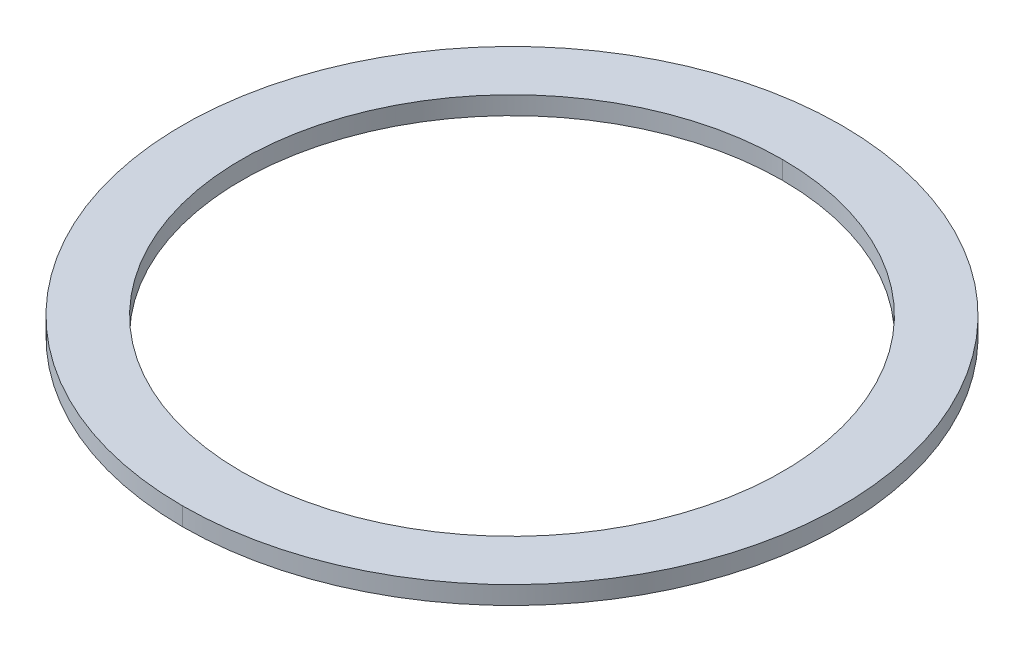
ISO-10303-21;
HEADER;
FILE_DESCRIPTION(('STEP AP214'),'2;1');
FILE_NAME('part.step','',(''),(''),'','','');
FILE_SCHEMA(('AUTOMOTIVE_DESIGN { 1 0 10303 214 1 1 1 1 }'));
ENDSEC;
DATA;
#1=APPLICATION_CONTEXT('core data for automotive mechanical design processes');
#2=APPLICATION_PROTOCOL_DEFINITION('international standard','automotive_design',2000,#1);
#3=PRODUCT_CONTEXT('',#1,'mechanical');
#4=PRODUCT('Part','Part','',(#3));
#5=PRODUCT_RELATED_PRODUCT_CATEGORY('part','',(#4));
#6=PRODUCT_DEFINITION_FORMATION('','',#4);
#7=PRODUCT_DEFINITION_CONTEXT('part definition',#1,'design');
#8=PRODUCT_DEFINITION('design','',#6,#7);
#9=PRODUCT_DEFINITION_SHAPE('','',#8);
#10=(LENGTH_UNIT() NAMED_UNIT(*) SI_UNIT(.MILLI.,.METRE.));
#11=(NAMED_UNIT(*) PLANE_ANGLE_UNIT() SI_UNIT($,.RADIAN.));
#12=(NAMED_UNIT(*) SI_UNIT($,.STERADIAN.) SOLID_ANGLE_UNIT());
#13=UNCERTAINTY_MEASURE_WITH_UNIT(LENGTH_MEASURE(1.E-05),#10,'distance_accuracy_value','');
#14=(GEOMETRIC_REPRESENTATION_CONTEXT(3) GLOBAL_UNCERTAINTY_ASSIGNED_CONTEXT((#13)) GLOBAL_UNIT_ASSIGNED_CONTEXT((#10,
#11,#12)) REPRESENTATION_CONTEXT('',''));
#15=CARTESIAN_POINT('',(0.,0.,0.));
#16=DIRECTION('',(0.,0.,1.));
#17=DIRECTION('',(1.,0.,0.));
#18=AXIS2_PLACEMENT_3D('',#15,#16,#17);
#19=CARTESIAN_POINT('',(0.,6.81685424949238,0.));
#20=DIRECTION('',(0.,-1.,0.));
#21=DIRECTION('',(0.,0.,-1.));
#22=AXIS2_PLACEMENT_3D('',#19,#20,#21);
#23=CYLINDRICAL_SURFACE('',#22,2.);
#24=CARTESIAN_POINT('',(0.,1.11,0.));
#25=DIRECTION('',(0.,1.,0.));
#26=DIRECTION('',(0.,0.,-1.));
#27=AXIS2_PLACEMENT_3D('',#24,#25,#26);
#28=CIRCLE('',#27,2.);
#29=CARTESIAN_POINT('',(0.,1.11,2.));
#30=VERTEX_POINT('',#29);
#31=CARTESIAN_POINT('',(0.,1.11,-2.));
#32=VERTEX_POINT('',#31);
#33=EDGE_CURVE('E11',#30,#32,#28,.T.);
#34=ORIENTED_EDGE('',*,*,#33,.F.);
#35=DIRECTION('',(0.,-1.,0.));
#36=VECTOR('',#35,1.);
#37=CARTESIAN_POINT('',(0.,6.81685424949238,2.));
#38=LINE('',#37,#36);
#39=CARTESIAN_POINT('',(0.,1.,2.));
#40=VERTEX_POINT('',#39);
#41=EDGE_CURVE('E23',#30,#40,#38,.T.);
#42=ORIENTED_EDGE('',*,*,#41,.T.);
#43=CARTESIAN_POINT('',(0.,1.,0.));
#44=DIRECTION('',(0.,1.,0.));
#45=DIRECTION('',(0.,0.,-1.));
#46=AXIS2_PLACEMENT_3D('',#43,#44,#45);
#47=CIRCLE('',#46,2.);
#48=CARTESIAN_POINT('',(0.,1.,-2.));
#49=VERTEX_POINT('',#48);
#50=EDGE_CURVE('E85',#40,#49,#47,.T.);
#51=ORIENTED_EDGE('',*,*,#50,.T.);
#52=DIRECTION('',(0.,-1.,0.));
#53=VECTOR('',#52,1.);
#54=CARTESIAN_POINT('',(0.,6.81685424949238,-2.));
#55=LINE('',#54,#53);
#56=EDGE_CURVE('E82',#32,#49,#55,.T.);
#57=ORIENTED_EDGE('',*,*,#56,.F.);
#58=EDGE_LOOP('',(#34,#42,#51,#57));
#59=FACE_BOUND('',#58,.T.);
#60=ADVANCED_FACE('F16',(#59),#23,.T.);
#61=CARTESIAN_POINT('',(0.,6.81685424949238,0.));
#62=DIRECTION('',(0.,-1.,0.));
#63=DIRECTION('',(0.,0.,-1.));
#64=AXIS2_PLACEMENT_3D('',#61,#62,#63);
#65=CYLINDRICAL_SURFACE('',#64,1.64116096886617);
#66=CARTESIAN_POINT('',(0.,1.11,0.));
#67=DIRECTION('',(0.,-1.,0.));
#68=DIRECTION('',(0.,0.,-1.));
#69=AXIS2_PLACEMENT_3D('',#66,#67,#68);
#70=CIRCLE('',#69,1.64116096886617);
#71=CARTESIAN_POINT('',(0.,1.11,1.64116096886617));
#72=VERTEX_POINT('',#71);
#73=CARTESIAN_POINT('',(0.,1.11,-1.64116096886617));
#74=VERTEX_POINT('',#73);
#75=EDGE_CURVE('E80',#72,#74,#70,.T.);
#76=ORIENTED_EDGE('',*,*,#75,.F.);
#77=DIRECTION('',(0.,-1.,0.));
#78=VECTOR('',#77,1.);
#79=CARTESIAN_POINT('',(0.,6.81685424949238,1.64116096886617));
#80=LINE('',#79,#78);
#81=CARTESIAN_POINT('',(0.,1.,1.64116096886617));
#82=VERTEX_POINT('',#81);
#83=EDGE_CURVE('E67',#72,#82,#80,.T.);
#84=ORIENTED_EDGE('',*,*,#83,.T.);
#85=CARTESIAN_POINT('',(0.,1.,0.));
#86=DIRECTION('',(0.,1.,0.));
#87=DIRECTION('',(0.,0.,-1.));
#88=AXIS2_PLACEMENT_3D('',#85,#86,#87);
#89=CIRCLE('',#88,1.64116096886617);
#90=CARTESIAN_POINT('',(0.,1.,-1.64116096886617));
#91=VERTEX_POINT('',#90);
#92=EDGE_CURVE('E62',#91,#82,#89,.T.);
#93=ORIENTED_EDGE('',*,*,#92,.F.);
#94=DIRECTION('',(0.,-1.,0.));
#95=VECTOR('',#94,1.);
#96=CARTESIAN_POINT('',(0.,6.81685424949238,-1.64116096886617));
#97=LINE('',#96,#95);
#98=EDGE_CURVE('E52',#74,#91,#97,.T.);
#99=ORIENTED_EDGE('',*,*,#98,.F.);
#100=EDGE_LOOP('',(#76,#84,#93,#99));
#101=FACE_BOUND('',#100,.T.);
#102=ADVANCED_FACE('F66',(#101),#65,.F.);
#103=CARTESIAN_POINT('',(-1.22928807039044,1.11,1.04302918199923));
#104=DIRECTION('',(0.,1.,0.));
#105=DIRECTION('',(0.,0.,1.));
#106=AXIS2_PLACEMENT_3D('',#103,#104,#105);
#107=PLANE('',#106);
#108=CARTESIAN_POINT('',(0.,1.11,0.));
#109=DIRECTION('',(0.,1.,0.));
#110=DIRECTION('',(0.,0.,-1.));
#111=AXIS2_PLACEMENT_3D('',#108,#109,#110);
#112=CIRCLE('',#111,2.);
#113=EDGE_CURVE('E63',#32,#30,#112,.T.);
#114=ORIENTED_EDGE('',*,*,#113,.T.);
#115=ORIENTED_EDGE('',*,*,#33,.T.);
#116=EDGE_LOOP('',(#114,#115));
#117=FACE_BOUND('',#116,.T.);
#118=CARTESIAN_POINT('',(0.,1.11,0.));
#119=DIRECTION('',(0.,-1.,0.));
#120=DIRECTION('',(0.,0.,-1.));
#121=AXIS2_PLACEMENT_3D('',#118,#119,#120);
#122=CIRCLE('',#121,1.64116096886617);
#123=EDGE_CURVE('E58',#74,#72,#122,.T.);
#124=ORIENTED_EDGE('',*,*,#123,.T.);
#125=ORIENTED_EDGE('',*,*,#75,.T.);
#126=EDGE_LOOP('',(#124,#125));
#127=FACE_BOUND('',#126,.T.);
#128=ADVANCED_FACE('F91',(#117,#127),#107,.T.);
#129=CARTESIAN_POINT('',(0.,6.81685424949238,0.));
#130=DIRECTION('',(0.,-1.,0.));
#131=DIRECTION('',(0.,0.,-1.));
#132=AXIS2_PLACEMENT_3D('',#129,#130,#131);
#133=CYLINDRICAL_SURFACE('',#132,2.);
#134=ORIENTED_EDGE('',*,*,#41,.F.);
#135=ORIENTED_EDGE('',*,*,#113,.F.);
#136=ORIENTED_EDGE('',*,*,#56,.T.);
#137=CARTESIAN_POINT('',(0.,1.,0.));
#138=DIRECTION('',(0.,1.,0.));
#139=DIRECTION('',(0.,0.,-1.));
#140=AXIS2_PLACEMENT_3D('',#137,#138,#139);
#141=CIRCLE('',#140,2.);
#142=EDGE_CURVE('E72',#49,#40,#141,.T.);
#143=ORIENTED_EDGE('',*,*,#142,.T.);
#144=EDGE_LOOP('',(#134,#135,#136,#143));
#145=FACE_BOUND('',#144,.T.);
#146=ADVANCED_FACE('F90',(#145),#133,.T.);
#147=CARTESIAN_POINT('',(0.,6.81685424949238,0.));
#148=DIRECTION('',(0.,-1.,0.));
#149=DIRECTION('',(0.,0.,-1.));
#150=AXIS2_PLACEMENT_3D('',#147,#148,#149);
#151=CYLINDRICAL_SURFACE('',#150,1.64116096886617);
#152=ORIENTED_EDGE('',*,*,#83,.F.);
#153=ORIENTED_EDGE('',*,*,#123,.F.);
#154=ORIENTED_EDGE('',*,*,#98,.T.);
#155=CARTESIAN_POINT('',(0.,1.,0.));
#156=DIRECTION('',(0.,1.,0.));
#157=DIRECTION('',(0.,0.,-1.));
#158=AXIS2_PLACEMENT_3D('',#155,#156,#157);
#159=CIRCLE('',#158,1.64116096886617);
#160=EDGE_CURVE('E56',#82,#91,#159,.T.);
#161=ORIENTED_EDGE('',*,*,#160,.F.);
#162=EDGE_LOOP('',(#152,#153,#154,#161));
#163=FACE_BOUND('',#162,.T.);
#164=ADVANCED_FACE('F54',(#163),#151,.F.);
#165=CARTESIAN_POINT('',(0.,1.,0.));
#166=DIRECTION('',(0.,1.,0.));
#167=DIRECTION('',(0.,0.,1.));
#168=AXIS2_PLACEMENT_3D('',#165,#166,#167);
#169=PLANE('',#168);
#170=ORIENTED_EDGE('',*,*,#92,.T.);
#171=ORIENTED_EDGE('',*,*,#160,.T.);
#172=EDGE_LOOP('',(#170,#171));
#173=FACE_BOUND('',#172,.T.);
#174=ORIENTED_EDGE('',*,*,#142,.F.);
#175=ORIENTED_EDGE('',*,*,#50,.F.);
#176=EDGE_LOOP('',(#174,#175));
#177=FACE_BOUND('',#176,.T.);
#178=ADVANCED_FACE('F70',(#173,#177),#169,.F.);
#179=CLOSED_SHELL('',(#60,#102,#128,#146,#164,#178));
#180=MANIFOLD_SOLID_BREP('B1',#179);
#181=ADVANCED_BREP_SHAPE_REPRESENTATION('',(#18,#180),#14);
#182=SHAPE_DEFINITION_REPRESENTATION(#9,#181);
ENDSEC;
END-ISO-10303-21;
